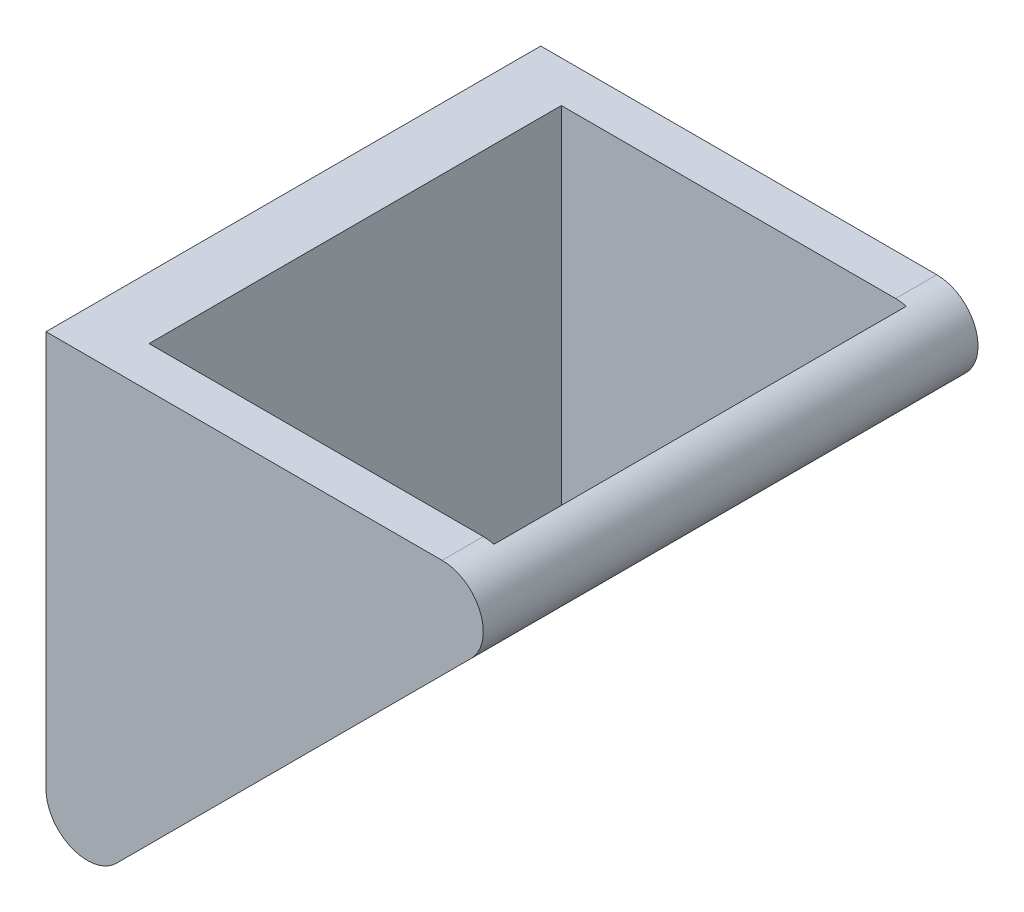
ISO-10303-21;
HEADER;
FILE_DESCRIPTION(('STEP AP214'),'2;1');
FILE_NAME('part.step','',(''),(''),'','','');
FILE_SCHEMA(('AUTOMOTIVE_DESIGN { 1 0 10303 214 1 1 1 1 }'));
ENDSEC;
DATA;
#1=APPLICATION_CONTEXT('core data for automotive mechanical design processes');
#2=APPLICATION_PROTOCOL_DEFINITION('international standard','automotive_design',2000,#1);
#3=PRODUCT_CONTEXT('',#1,'mechanical');
#4=PRODUCT('Part','Part','',(#3));
#5=PRODUCT_RELATED_PRODUCT_CATEGORY('part','',(#4));
#6=PRODUCT_DEFINITION_FORMATION('','',#4);
#7=PRODUCT_DEFINITION_CONTEXT('part definition',#1,'design');
#8=PRODUCT_DEFINITION('design','',#6,#7);
#9=PRODUCT_DEFINITION_SHAPE('','',#8);
#10=(LENGTH_UNIT() NAMED_UNIT(*) SI_UNIT(.MILLI.,.METRE.));
#11=(NAMED_UNIT(*) PLANE_ANGLE_UNIT() SI_UNIT($,.RADIAN.));
#12=(NAMED_UNIT(*) SI_UNIT($,.STERADIAN.) SOLID_ANGLE_UNIT());
#13=UNCERTAINTY_MEASURE_WITH_UNIT(LENGTH_MEASURE(1.E-05),#10,'distance_accuracy_value','');
#14=(GEOMETRIC_REPRESENTATION_CONTEXT(3) GLOBAL_UNCERTAINTY_ASSIGNED_CONTEXT((#13)) GLOBAL_UNIT_ASSIGNED_CONTEXT((#10,
#11,#12)) REPRESENTATION_CONTEXT('',''));
#15=CARTESIAN_POINT('',(0.,0.,0.));
#16=DIRECTION('',(0.,0.,1.));
#17=DIRECTION('',(1.,0.,0.));
#18=AXIS2_PLACEMENT_3D('',#15,#16,#17);
#19=CARTESIAN_POINT('',(4.94974746830586,-4.94974746830581,12.));
#20=DIRECTION('',(-0.707106781186551,0.707106781186544,0.));
#21=DIRECTION('',(-0.707106781186544,-0.707106781186551,0.));
#22=AXIS2_PLACEMENT_3D('',#19,#20,#21);
#23=PLANE('',#22);
#24=DIRECTION('',(-0.707106781186544,-0.707106781186551,0.));
#25=VECTOR('',#24,1.);
#26=CARTESIAN_POINT('',(4.94974746830586,-4.94974746830581,11.));
#27=LINE('',#26,#25);
#28=CARTESIAN_POINT('',(9.86542076290069,-0.0340741737109296,11.));
#29=VERTEX_POINT('',#28);
#30=CARTESIAN_POINT('',(1.5,-8.3994949366117,11.));
#31=VERTEX_POINT('',#30);
#32=EDGE_CURVE('E191',#29,#31,#27,.T.);
#33=ORIENTED_EDGE('',*,*,#32,.F.);
#34=DIRECTION('',(0.,0.,-1.));
#35=VECTOR('',#34,1.);
#36=CARTESIAN_POINT('',(9.86542076290069,-0.0340741737109303,11.));
#37=LINE('',#36,#35);
#38=CARTESIAN_POINT('',(9.86542076290069,-0.0340741737109298,1.));
#39=VERTEX_POINT('',#38);
#40=EDGE_CURVE('E260',#29,#39,#37,.T.);
#41=ORIENTED_EDGE('',*,*,#40,.T.);
#42=DIRECTION('',(0.707106781186544,0.707106781186551,0.));
#43=VECTOR('',#42,1.);
#44=CARTESIAN_POINT('',(4.94974746830586,-4.94974746830581,1.));
#45=LINE('',#44,#43);
#46=CARTESIAN_POINT('',(1.5,-8.3994949366117,1.));
#47=VERTEX_POINT('',#46);
#48=EDGE_CURVE('E180',#47,#39,#45,.T.);
#49=ORIENTED_EDGE('',*,*,#48,.F.);
#50=DIRECTION('',(0.,0.,-1.));
#51=VECTOR('',#50,1.);
#52=CARTESIAN_POINT('',(1.5,-8.3994949366117,12.));
#53=LINE('',#52,#51);
#54=EDGE_CURVE('E224',#31,#47,#53,.T.);
#55=ORIENTED_EDGE('',*,*,#54,.F.);
#56=EDGE_LOOP('',(#33,#41,#49,#55));
#57=FACE_BOUND('',#56,.T.);
#58=DIRECTION('',(0.,0.,-1.));
#59=VECTOR('',#58,1.);
#60=CARTESIAN_POINT('',(3.73816673318738,-6.16132820342429,0.));
#61=LINE('',#60,#59);
#62=CARTESIAN_POINT('',(3.73816673318738,-6.16132820342429,8.75));
#63=VERTEX_POINT('',#62);
#64=CARTESIAN_POINT('',(3.73816673318738,-6.1613282034243,3.25));
#65=VERTEX_POINT('',#64);
#66=EDGE_CURVE('E153',#63,#65,#61,.T.);
#67=ORIENTED_EDGE('',*,*,#66,.T.);
#68=DIRECTION('',(0.707106781186547,0.707106781186548,0.));
#69=VECTOR('',#68,1.);
#70=CARTESIAN_POINT('',(4.94974746830584,-4.94974746830584,3.25));
#71=LINE('',#70,#69);
#72=CARTESIAN_POINT('',(7.62725402971339,-2.27224090689828,3.25));
#73=VERTEX_POINT('',#72);
#74=EDGE_CURVE('E61',#65,#73,#71,.T.);
#75=ORIENTED_EDGE('',*,*,#74,.T.);
#76=DIRECTION('',(0.,0.,-1.));
#77=VECTOR('',#76,1.);
#78=CARTESIAN_POINT('',(7.62725402971339,-2.27224090689828,0.));
#79=LINE('',#78,#77);
#80=CARTESIAN_POINT('',(7.62725402971339,-2.27224090689828,8.75));
#81=VERTEX_POINT('',#80);
#82=EDGE_CURVE('E159',#81,#73,#79,.T.);
#83=ORIENTED_EDGE('',*,*,#82,.F.);
#84=DIRECTION('',(0.707106781186547,0.707106781186548,0.));
#85=VECTOR('',#84,1.);
#86=CARTESIAN_POINT('',(4.94974746830584,-4.94974746830584,8.75));
#87=LINE('',#86,#85);
#88=EDGE_CURVE('E143',#63,#81,#87,.T.);
#89=ORIENTED_EDGE('',*,*,#88,.F.);
#90=EDGE_LOOP('',(#67,#75,#83,#89));
#91=FACE_BOUND('',#90,.T.);
#92=ADVANCED_FACE('F45',(#57,#91),#23,.T.);
#93=CARTESIAN_POINT('',(6.01040764008569,-6.01040764008562,12.));
#94=DIRECTION('',(-0.707106781186551,0.707106781186544,0.));
#95=DIRECTION('',(-0.707106781186544,-0.707106781186551,0.));
#96=AXIS2_PLACEMENT_3D('',#93,#94,#95);
#97=PLANE('',#96);
#98=DIRECTION('',(0.707106781186544,0.707106781186551,0.));
#99=VECTOR('',#98,1.);
#100=CARTESIAN_POINT('',(6.01040764008569,-6.01040764008562,12.));
#101=LINE('',#100,#99);
#102=CARTESIAN_POINT('',(1.70710678118655,-10.3137084989848,12.));
#103=VERTEX_POINT('',#102);
#104=CARTESIAN_POINT('',(10.3137084989847,-1.70710678118654,12.));
#105=VERTEX_POINT('',#104);
#106=EDGE_CURVE('E203',#103,#105,#101,.T.);
#107=ORIENTED_EDGE('',*,*,#106,.F.);
#108=DIRECTION('',(0.,0.,-1.));
#109=VECTOR('',#108,1.);
#110=CARTESIAN_POINT('',(1.70710678118655,-10.3137084989848,12.));
#111=LINE('',#110,#109);
#112=CARTESIAN_POINT('',(1.70710678118655,-10.3137084989848,0.));
#113=VERTEX_POINT('',#112);
#114=EDGE_CURVE('E231',#103,#113,#111,.T.);
#115=ORIENTED_EDGE('',*,*,#114,.T.);
#116=DIRECTION('',(0.707106781186544,0.707106781186551,0.));
#117=VECTOR('',#116,1.);
#118=CARTESIAN_POINT('',(6.01040764008569,-6.01040764008562,0.));
#119=LINE('',#118,#117);
#120=CARTESIAN_POINT('',(10.3137084989847,-1.70710678118654,0.));
#121=VERTEX_POINT('',#120);
#122=EDGE_CURVE('E210',#113,#121,#119,.T.);
#123=ORIENTED_EDGE('',*,*,#122,.T.);
#124=DIRECTION('',(0.,0.,-1.));
#125=VECTOR('',#124,1.);
#126=CARTESIAN_POINT('',(10.3137084989847,-1.70710678118654,12.));
#127=LINE('',#126,#125);
#128=EDGE_CURVE('E228',#121,#105,#127,.F.);
#129=ORIENTED_EDGE('',*,*,#128,.T.);
#130=EDGE_LOOP('',(#107,#115,#123,#129));
#131=FACE_BOUND('',#130,.T.);
#132=DIRECTION('',(0.707106781186544,0.707106781186551,0.));
#133=VECTOR('',#132,1.);
#134=CARTESIAN_POINT('',(6.01040764008569,-6.01040764008562,3.25));
#135=LINE('',#134,#133);
#136=CARTESIAN_POINT('',(4.7988269049672,-7.22198837520412,3.25));
#137=VERTEX_POINT('',#136);
#138=CARTESIAN_POINT('',(8.68791420149319,-3.33290107867808,3.25));
#139=VERTEX_POINT('',#138);
#140=EDGE_CURVE('E11',#137,#139,#135,.T.);
#141=ORIENTED_EDGE('',*,*,#140,.F.);
#142=DIRECTION('',(0.,0.,-1.));
#143=VECTOR('',#142,1.);
#144=CARTESIAN_POINT('',(4.7988269049672,-7.22198837520412,12.));
#145=LINE('',#144,#143);
#146=CARTESIAN_POINT('',(4.7988269049672,-7.22198837520412,8.75));
#147=VERTEX_POINT('',#146);
#148=EDGE_CURVE('E266',#147,#137,#145,.T.);
#149=ORIENTED_EDGE('',*,*,#148,.F.);
#150=DIRECTION('',(0.707106781186544,0.707106781186551,0.));
#151=VECTOR('',#150,1.);
#152=CARTESIAN_POINT('',(6.01040764008569,-6.01040764008562,8.75));
#153=LINE('',#152,#151);
#154=CARTESIAN_POINT('',(8.68791420149319,-3.33290107867808,8.75));
#155=VERTEX_POINT('',#154);
#156=EDGE_CURVE('E146',#147,#155,#153,.T.);
#157=ORIENTED_EDGE('',*,*,#156,.T.);
#158=DIRECTION('',(0.,0.,-1.));
#159=VECTOR('',#158,1.);
#160=CARTESIAN_POINT('',(8.68791420149319,-3.33290107867808,12.));
#161=LINE('',#160,#159);
#162=EDGE_CURVE('E54',#155,#139,#161,.T.);
#163=ORIENTED_EDGE('',*,*,#162,.T.);
#164=EDGE_LOOP('',(#141,#149,#157,#163));
#165=FACE_BOUND('',#164,.T.);
#166=ADVANCED_FACE('F274',(#131,#165),#97,.F.);
#167=CARTESIAN_POINT('',(1.5,0.,12.));
#168=DIRECTION('',(1.,0.,0.));
#169=DIRECTION('',(0.,1.,0.));
#170=AXIS2_PLACEMENT_3D('',#167,#168,#169);
#171=PLANE('',#170);
#172=DIRECTION('',(0.,-1.,0.));
#173=VECTOR('',#172,1.);
#174=CARTESIAN_POINT('',(1.5,0.,1.));
#175=LINE('',#174,#173);
#176=CARTESIAN_POINT('',(1.5,0.,1.));
#177=VERTEX_POINT('',#176);
#178=EDGE_CURVE('E177',#177,#47,#175,.T.);
#179=ORIENTED_EDGE('',*,*,#178,.F.);
#180=DIRECTION('',(0.,0.,-1.));
#181=VECTOR('',#180,1.);
#182=CARTESIAN_POINT('',(1.5,0.,12.));
#183=LINE('',#182,#181);
#184=CARTESIAN_POINT('',(1.5,0.,11.));
#185=VERTEX_POINT('',#184);
#186=EDGE_CURVE('E220',#185,#177,#183,.T.);
#187=ORIENTED_EDGE('',*,*,#186,.F.);
#188=DIRECTION('',(0.,1.,0.));
#189=VECTOR('',#188,1.);
#190=CARTESIAN_POINT('',(1.5,0.,11.));
#191=LINE('',#190,#189);
#192=EDGE_CURVE('E187',#31,#185,#191,.T.);
#193=ORIENTED_EDGE('',*,*,#192,.F.);
#194=ORIENTED_EDGE('',*,*,#54,.T.);
#195=EDGE_LOOP('',(#179,#187,#193,#194));
#196=FACE_BOUND('',#195,.T.);
#197=ADVANCED_FACE('F296',(#196),#171,.T.);
#198=CARTESIAN_POINT('',(0.,0.,12.));
#199=DIRECTION('',(1.,0.,0.));
#200=DIRECTION('',(0.,1.,0.));
#201=AXIS2_PLACEMENT_3D('',#198,#199,#200);
#202=PLANE('',#201);
#203=DIRECTION('',(0.,-1.,0.));
#204=VECTOR('',#203,1.);
#205=CARTESIAN_POINT('',(0.,0.,0.));
#206=LINE('',#205,#204);
#207=CARTESIAN_POINT('',(0.,0.,0.));
#208=VERTEX_POINT('',#207);
#209=CARTESIAN_POINT('',(0.,-9.60660171779826,0.));
#210=VERTEX_POINT('',#209);
#211=EDGE_CURVE('E194',#208,#210,#206,.T.);
#212=ORIENTED_EDGE('',*,*,#211,.T.);
#213=DIRECTION('',(0.,0.,-1.));
#214=VECTOR('',#213,1.);
#215=CARTESIAN_POINT('',(0.,-9.60660171779826,12.));
#216=LINE('',#215,#214);
#217=CARTESIAN_POINT('',(0.,-9.60660171779826,12.));
#218=VERTEX_POINT('',#217);
#219=EDGE_CURVE('E241',#210,#218,#216,.F.);
#220=ORIENTED_EDGE('',*,*,#219,.T.);
#221=DIRECTION('',(0.,-1.,0.));
#222=VECTOR('',#221,1.);
#223=CARTESIAN_POINT('',(0.,0.,12.));
#224=LINE('',#223,#222);
#225=CARTESIAN_POINT('',(0.,0.,12.));
#226=VERTEX_POINT('',#225);
#227=EDGE_CURVE('E198',#226,#218,#224,.T.);
#228=ORIENTED_EDGE('',*,*,#227,.F.);
#229=DIRECTION('',(0.,0.,-1.));
#230=VECTOR('',#229,1.);
#231=CARTESIAN_POINT('',(0.,0.,12.));
#232=LINE('',#231,#230);
#233=EDGE_CURVE('E207',#226,#208,#232,.T.);
#234=ORIENTED_EDGE('',*,*,#233,.T.);
#235=EDGE_LOOP('',(#212,#220,#228,#234));
#236=FACE_BOUND('',#235,.T.);
#237=ADVANCED_FACE('F331',(#236),#202,.F.);
#238=CARTESIAN_POINT('',(0.,0.,12.));
#239=DIRECTION('',(0.,-1.,0.));
#240=DIRECTION('',(1.,0.,0.));
#241=AXIS2_PLACEMENT_3D('',#238,#239,#240);
#242=PLANE('',#241);
#243=DIRECTION('',(-1.,0.,0.));
#244=VECTOR('',#243,1.);
#245=CARTESIAN_POINT('',(0.,0.,12.));
#246=LINE('',#245,#244);
#247=CARTESIAN_POINT('',(9.60660171779817,0.,12.));
#248=VERTEX_POINT('',#247);
#249=EDGE_CURVE('E195',#248,#226,#246,.T.);
#250=ORIENTED_EDGE('',*,*,#249,.F.);
#251=DIRECTION('',(0.,0.,-1.));
#252=VECTOR('',#251,1.);
#253=CARTESIAN_POINT('',(9.60660171779817,0.,12.));
#254=LINE('',#253,#252);
#255=CARTESIAN_POINT('',(9.60660171779817,0.,11.));
#256=VERTEX_POINT('',#255);
#257=EDGE_CURVE('E253',#248,#256,#254,.T.);
#258=ORIENTED_EDGE('',*,*,#257,.T.);
#259=DIRECTION('',(-1.,0.,0.));
#260=VECTOR('',#259,1.);
#261=CARTESIAN_POINT('',(0.,0.,11.));
#262=LINE('',#261,#260);
#263=EDGE_CURVE('E184',#256,#185,#262,.T.);
#264=ORIENTED_EDGE('',*,*,#263,.T.);
#265=ORIENTED_EDGE('',*,*,#186,.T.);
#266=DIRECTION('',(1.,0.,0.));
#267=VECTOR('',#266,1.);
#268=CARTESIAN_POINT('',(12.0208152801712,0.,1.));
#269=LINE('',#268,#267);
#270=CARTESIAN_POINT('',(9.60660171779817,0.,1.));
#271=VERTEX_POINT('',#270);
#272=EDGE_CURVE('E169',#177,#271,#269,.T.);
#273=ORIENTED_EDGE('',*,*,#272,.T.);
#274=DIRECTION('',(0.,0.,-1.));
#275=VECTOR('',#274,1.);
#276=CARTESIAN_POINT('',(9.60660171779817,0.,12.));
#277=LINE('',#276,#275);
#278=CARTESIAN_POINT('',(9.60660171779817,0.,0.));
#279=VERTEX_POINT('',#278);
#280=EDGE_CURVE('E250',#271,#279,#277,.T.);
#281=ORIENTED_EDGE('',*,*,#280,.T.);
#282=DIRECTION('',(-1.,0.,0.));
#283=VECTOR('',#282,1.);
#284=CARTESIAN_POINT('',(0.,0.,0.));
#285=LINE('',#284,#283);
#286=EDGE_CURVE('E199',#279,#208,#285,.T.);
#287=ORIENTED_EDGE('',*,*,#286,.T.);
#288=ORIENTED_EDGE('',*,*,#233,.F.);
#289=EDGE_LOOP('',(#250,#258,#264,#265,#273,#281,#287,#288));
#290=FACE_BOUND('',#289,.T.);
#291=ADVANCED_FACE('F326',(#290),#242,.F.);
#292=CARTESIAN_POINT('',(0.,0.,12.));
#293=DIRECTION('',(0.,0.,1.));
#294=DIRECTION('',(1.,0.,0.));
#295=AXIS2_PLACEMENT_3D('',#292,#293,#294);
#296=PLANE('',#295);
#297=ORIENTED_EDGE('',*,*,#227,.T.);
#298=CARTESIAN_POINT('',(1.,-9.60660171779826,12.));
#299=DIRECTION('',(0.,0.,1.));
#300=DIRECTION('',(1.,0.,0.));
#301=AXIS2_PLACEMENT_3D('',#298,#299,#300);
#302=CIRCLE('',#301,1.);
#303=EDGE_CURVE('E247',#218,#103,#302,.T.);
#304=ORIENTED_EDGE('',*,*,#303,.T.);
#305=ORIENTED_EDGE('',*,*,#106,.T.);
#306=CARTESIAN_POINT('',(9.60660171779817,-0.999999999999999,12.));
#307=DIRECTION('',(0.,0.,1.));
#308=DIRECTION('',(1.,0.,0.));
#309=AXIS2_PLACEMENT_3D('',#306,#307,#308);
#310=CIRCLE('',#309,1.);
#311=EDGE_CURVE('E244',#105,#248,#310,.T.);
#312=ORIENTED_EDGE('',*,*,#311,.T.);
#313=ORIENTED_EDGE('',*,*,#249,.T.);
#314=EDGE_LOOP('',(#297,#304,#305,#312,#313));
#315=FACE_BOUND('',#314,.T.);
#316=ADVANCED_FACE('F315',(#315),#296,.T.);
#317=CARTESIAN_POINT('',(0.,0.,0.));
#318=DIRECTION('',(0.,0.,1.));
#319=DIRECTION('',(1.,0.,0.));
#320=AXIS2_PLACEMENT_3D('',#317,#318,#319);
#321=PLANE('',#320);
#322=ORIENTED_EDGE('',*,*,#122,.F.);
#323=CARTESIAN_POINT('',(1.,-9.60660171779826,0.));
#324=DIRECTION('',(0.,0.,1.));
#325=DIRECTION('',(1.,0.,0.));
#326=AXIS2_PLACEMENT_3D('',#323,#324,#325);
#327=CIRCLE('',#326,1.);
#328=EDGE_CURVE('E238',#113,#210,#327,.F.);
#329=ORIENTED_EDGE('',*,*,#328,.T.);
#330=ORIENTED_EDGE('',*,*,#211,.F.);
#331=ORIENTED_EDGE('',*,*,#286,.F.);
#332=CARTESIAN_POINT('',(9.60660171779817,-0.999999999999999,0.));
#333=DIRECTION('',(0.,0.,1.));
#334=DIRECTION('',(1.,0.,0.));
#335=AXIS2_PLACEMENT_3D('',#332,#333,#334);
#336=CIRCLE('',#335,1.);
#337=EDGE_CURVE('E235',#279,#121,#336,.F.);
#338=ORIENTED_EDGE('',*,*,#337,.T.);
#339=EDGE_LOOP('',(#322,#329,#330,#331,#338));
#340=FACE_BOUND('',#339,.T.);
#341=ADVANCED_FACE('F333',(#340),#321,.F.);
#342=CARTESIAN_POINT('',(0.,0.,11.));
#343=DIRECTION('',(0.,0.,-1.));
#344=DIRECTION('',(-1.,0.,0.));
#345=AXIS2_PLACEMENT_3D('',#342,#343,#344);
#346=PLANE('',#345);
#347=ORIENTED_EDGE('',*,*,#263,.F.);
#348=CARTESIAN_POINT('',(9.60660171779817,-0.999999999999999,11.));
#349=DIRECTION('',(0.,0.,-1.));
#350=DIRECTION('',(-1.,0.,0.));
#351=AXIS2_PLACEMENT_3D('',#348,#349,#350);
#352=CIRCLE('',#351,1.);
#353=EDGE_CURVE('E257',#256,#29,#352,.T.);
#354=ORIENTED_EDGE('',*,*,#353,.T.);
#355=ORIENTED_EDGE('',*,*,#32,.T.);
#356=ORIENTED_EDGE('',*,*,#192,.T.);
#357=EDGE_LOOP('',(#347,#354,#355,#356));
#358=FACE_BOUND('',#357,.T.);
#359=ADVANCED_FACE('F308',(#358),#346,.T.);
#360=CARTESIAN_POINT('',(0.,0.,1.));
#361=DIRECTION('',(0.,0.,1.));
#362=DIRECTION('',(1.,0.,0.));
#363=AXIS2_PLACEMENT_3D('',#360,#361,#362);
#364=PLANE('',#363);
#365=ORIENTED_EDGE('',*,*,#48,.T.);
#366=CARTESIAN_POINT('',(9.60660171779817,-0.999999999999999,1.));
#367=DIRECTION('',(0.,0.,1.));
#368=DIRECTION('',(1.,0.,0.));
#369=AXIS2_PLACEMENT_3D('',#366,#367,#368);
#370=CIRCLE('',#369,1.);
#371=EDGE_CURVE('E263',#39,#271,#370,.T.);
#372=ORIENTED_EDGE('',*,*,#371,.T.);
#373=ORIENTED_EDGE('',*,*,#272,.F.);
#374=ORIENTED_EDGE('',*,*,#178,.T.);
#375=EDGE_LOOP('',(#365,#372,#373,#374));
#376=FACE_BOUND('',#375,.T.);
#377=ADVANCED_FACE('F303',(#376),#364,.T.);
#378=CARTESIAN_POINT('',(1.,-9.60660171779826,12.));
#379=DIRECTION('',(0.,0.,-1.));
#380=DIRECTION('',(-1.,0.,0.));
#381=AXIS2_PLACEMENT_3D('',#378,#379,#380);
#382=CYLINDRICAL_SURFACE('',#381,1.);
#383=ORIENTED_EDGE('',*,*,#303,.F.);
#384=ORIENTED_EDGE('',*,*,#219,.F.);
#385=ORIENTED_EDGE('',*,*,#328,.F.);
#386=ORIENTED_EDGE('',*,*,#114,.F.);
#387=EDGE_LOOP('',(#383,#384,#385,#386));
#388=FACE_BOUND('',#387,.T.);
#389=ADVANCED_FACE('F286',(#388),#382,.T.);
#390=CARTESIAN_POINT('',(9.60660171779817,-0.999999999999999,12.));
#391=DIRECTION('',(0.,0.,-1.));
#392=DIRECTION('',(-1.,0.,0.));
#393=AXIS2_PLACEMENT_3D('',#390,#391,#392);
#394=CYLINDRICAL_SURFACE('',#393,1.);
#395=ORIENTED_EDGE('',*,*,#311,.F.);
#396=ORIENTED_EDGE('',*,*,#128,.F.);
#397=ORIENTED_EDGE('',*,*,#337,.F.);
#398=ORIENTED_EDGE('',*,*,#280,.F.);
#399=ORIENTED_EDGE('',*,*,#371,.F.);
#400=ORIENTED_EDGE('',*,*,#40,.F.);
#401=ORIENTED_EDGE('',*,*,#353,.F.);
#402=ORIENTED_EDGE('',*,*,#257,.F.);
#403=EDGE_LOOP('',(#395,#396,#397,#398,#399,#400,#401,#402));
#404=FACE_BOUND('',#403,.T.);
#405=ADVANCED_FACE('F47',(#404),#394,.T.);
#406=CARTESIAN_POINT('',(10.6066017177982,-10.6066017177982,3.25));
#407=DIRECTION('',(0.,0.,1.));
#408=DIRECTION('',(1.,0.,0.));
#409=AXIS2_PLACEMENT_3D('',#406,#407,#408);
#410=PLANE('',#409);
#411=ORIENTED_EDGE('',*,*,#140,.T.);
#412=DIRECTION('',(-0.707106781186548,0.707106781186547,0.));
#413=VECTOR('',#412,1.);
#414=CARTESIAN_POINT('',(13.2841082792058,-7.92909515639066,3.25));
#415=LINE('',#414,#413);
#416=EDGE_CURVE('E166',#139,#73,#415,.T.);
#417=ORIENTED_EDGE('',*,*,#416,.T.);
#418=ORIENTED_EDGE('',*,*,#74,.F.);
#419=DIRECTION('',(-0.707106781186548,0.707106781186547,0.));
#420=VECTOR('',#419,1.);
#421=CARTESIAN_POINT('',(9.39502098267976,-11.8181824529167,3.25));
#422=LINE('',#421,#420);
#423=EDGE_CURVE('E150',#137,#65,#422,.T.);
#424=ORIENTED_EDGE('',*,*,#423,.F.);
#425=EDGE_LOOP('',(#411,#417,#418,#424));
#426=FACE_BOUND('',#425,.T.);
#427=ADVANCED_FACE('F278',(#426),#410,.T.);
#428=CARTESIAN_POINT('',(13.2841082792058,-7.92909515639066,0.));
#429=DIRECTION('',(0.707106781186547,0.707106781186548,0.));
#430=DIRECTION('',(-0.707106781186548,0.707106781186547,0.));
#431=AXIS2_PLACEMENT_3D('',#428,#429,#430);
#432=PLANE('',#431);
#433=DIRECTION('',(-0.707106781186548,0.707106781186547,0.));
#434=VECTOR('',#433,1.);
#435=CARTESIAN_POINT('',(13.2841082792058,-7.92909515639066,8.75));
#436=LINE('',#435,#434);
#437=EDGE_CURVE('E149',#155,#81,#436,.T.);
#438=ORIENTED_EDGE('',*,*,#437,.T.);
#439=ORIENTED_EDGE('',*,*,#82,.T.);
#440=ORIENTED_EDGE('',*,*,#416,.F.);
#441=ORIENTED_EDGE('',*,*,#162,.F.);
#442=EDGE_LOOP('',(#438,#439,#440,#441));
#443=FACE_BOUND('',#442,.T.);
#444=ADVANCED_FACE('F277',(#443),#432,.F.);
#445=CARTESIAN_POINT('',(10.6066017177982,-10.6066017177982,8.75));
#446=DIRECTION('',(0.,0.,1.));
#447=DIRECTION('',(1.,0.,0.));
#448=AXIS2_PLACEMENT_3D('',#445,#446,#447);
#449=PLANE('',#448);
#450=DIRECTION('',(-0.707106781186548,0.707106781186547,0.));
#451=VECTOR('',#450,1.);
#452=CARTESIAN_POINT('',(9.39502098267976,-11.8181824529167,8.75));
#453=LINE('',#452,#451);
#454=EDGE_CURVE('E69',#147,#63,#453,.T.);
#455=ORIENTED_EDGE('',*,*,#454,.T.);
#456=ORIENTED_EDGE('',*,*,#88,.T.);
#457=ORIENTED_EDGE('',*,*,#437,.F.);
#458=ORIENTED_EDGE('',*,*,#156,.F.);
#459=EDGE_LOOP('',(#455,#456,#457,#458));
#460=FACE_BOUND('',#459,.T.);
#461=ADVANCED_FACE('F140',(#460),#449,.F.);
#462=CARTESIAN_POINT('',(9.39502098267976,-11.8181824529167,0.));
#463=DIRECTION('',(0.707106781186547,0.707106781186548,0.));
#464=DIRECTION('',(-0.707106781186548,0.707106781186547,0.));
#465=AXIS2_PLACEMENT_3D('',#462,#463,#464);
#466=PLANE('',#465);
#467=ORIENTED_EDGE('',*,*,#148,.T.);
#468=ORIENTED_EDGE('',*,*,#423,.T.);
#469=ORIENTED_EDGE('',*,*,#66,.F.);
#470=ORIENTED_EDGE('',*,*,#454,.F.);
#471=EDGE_LOOP('',(#467,#468,#469,#470));
#472=FACE_BOUND('',#471,.T.);
#473=ADVANCED_FACE('F154',(#472),#466,.T.);
#474=CLOSED_SHELL('',(#92,#166,#197,#237,#291,#316,#341,#359,#377,#389,#405,#427,#444,#461,#473));
#475=MANIFOLD_SOLID_BREP('B2',#474);
#476=ADVANCED_BREP_SHAPE_REPRESENTATION('',(#18,#475),#14);
#477=SHAPE_DEFINITION_REPRESENTATION(#9,#476);
ENDSEC;
END-ISO-10303-21;
